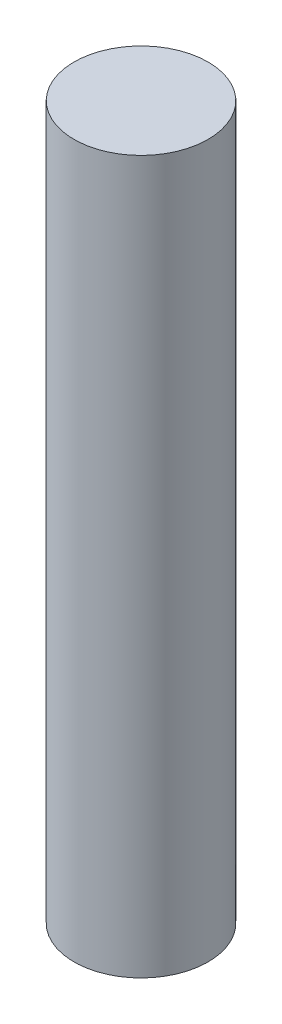
ISO-10303-21;
HEADER;
FILE_DESCRIPTION(('STEP AP214'),'2;1');
FILE_NAME('part.step','',(''),(''),'','','');
FILE_SCHEMA(('AUTOMOTIVE_DESIGN { 1 0 10303 214 1 1 1 1 }'));
ENDSEC;
DATA;
#1=APPLICATION_CONTEXT('core data for automotive mechanical design processes');
#2=APPLICATION_PROTOCOL_DEFINITION('international standard','automotive_design',2000,#1);
#3=PRODUCT_CONTEXT('',#1,'mechanical');
#4=PRODUCT('Part','Part','',(#3));
#5=PRODUCT_RELATED_PRODUCT_CATEGORY('part','',(#4));
#6=PRODUCT_DEFINITION_FORMATION('','',#4);
#7=PRODUCT_DEFINITION_CONTEXT('part definition',#1,'design');
#8=PRODUCT_DEFINITION('design','',#6,#7);
#9=PRODUCT_DEFINITION_SHAPE('','',#8);
#10=(LENGTH_UNIT() NAMED_UNIT(*) SI_UNIT(.MILLI.,.METRE.));
#11=(NAMED_UNIT(*) PLANE_ANGLE_UNIT() SI_UNIT($,.RADIAN.));
#12=(NAMED_UNIT(*) SI_UNIT($,.STERADIAN.) SOLID_ANGLE_UNIT());
#13=UNCERTAINTY_MEASURE_WITH_UNIT(LENGTH_MEASURE(1.E-05),#10,'distance_accuracy_value','');
#14=(GEOMETRIC_REPRESENTATION_CONTEXT(3) GLOBAL_UNCERTAINTY_ASSIGNED_CONTEXT((#13)) GLOBAL_UNIT_ASSIGNED_CONTEXT((#10,
#11,#12)) REPRESENTATION_CONTEXT('',''));
#15=CARTESIAN_POINT('',(0.,0.,0.));
#16=DIRECTION('',(0.,0.,1.));
#17=DIRECTION('',(1.,0.,0.));
#18=AXIS2_PLACEMENT_3D('',#15,#16,#17);
#19=CARTESIAN_POINT('',(0.,1190.,0.));
#20=DIRECTION('',(0.,1.,0.));
#21=DIRECTION('',(0.,0.,1.));
#22=AXIS2_PLACEMENT_3D('',#19,#20,#21);
#23=PLANE('',#22);
#24=CARTESIAN_POINT('',(0.,1190.,0.));
#25=DIRECTION('',(0.,-1.,0.));
#26=DIRECTION('',(0.,0.,-1.));
#27=AXIS2_PLACEMENT_3D('',#24,#25,#26);
#28=CIRCLE('',#27,112.);
#29=CARTESIAN_POINT('',(0.,1190.,-112.));
#30=VERTEX_POINT('',#29);
#31=EDGE_CURVE('E10',#30,#30,#28,.T.);
#32=ORIENTED_EDGE('',*,*,#31,.F.);
#33=EDGE_LOOP('',(#32));
#34=FACE_BOUND('',#33,.T.);
#35=ADVANCED_FACE('F40',(#34),#23,.T.);
#36=CARTESIAN_POINT('',(0.,-226.144602760346,0.));
#37=DIRECTION('',(0.,-1.,0.));
#38=DIRECTION('',(0.,0.,-1.));
#39=AXIS2_PLACEMENT_3D('',#36,#37,#38);
#40=CYLINDRICAL_SURFACE('',#39,112.);
#41=ORIENTED_EDGE('',*,*,#31,.T.);
#42=EDGE_LOOP('',(#41));
#43=FACE_BOUND('',#42,.T.);
#44=CARTESIAN_POINT('',(0.,0.,0.));
#45=DIRECTION('',(0.,-1.,0.));
#46=DIRECTION('',(0.,0.,-1.));
#47=AXIS2_PLACEMENT_3D('',#44,#45,#46);
#48=CIRCLE('',#47,112.);
#49=CARTESIAN_POINT('',(0.,0.,-112.));
#50=VERTEX_POINT('',#49);
#51=EDGE_CURVE('E43',#50,#50,#48,.T.);
#52=ORIENTED_EDGE('',*,*,#51,.F.);
#53=EDGE_LOOP('',(#52));
#54=FACE_BOUND('',#53,.T.);
#55=ADVANCED_FACE('F51',(#43,#54),#40,.T.);
#56=CARTESIAN_POINT('',(0.,0.,0.));
#57=DIRECTION('',(0.,-1.,0.));
#58=DIRECTION('',(0.,0.,-1.));
#59=AXIS2_PLACEMENT_3D('',#56,#57,#58);
#60=PLANE('',#59);
#61=ORIENTED_EDGE('',*,*,#51,.T.);
#62=EDGE_LOOP('',(#61));
#63=FACE_BOUND('',#62,.T.);
#64=ADVANCED_FACE('F47',(#63),#60,.T.);
#65=CLOSED_SHELL('',(#35,#55,#64));
#66=MANIFOLD_SOLID_BREP('B2',#65);
#67=ADVANCED_BREP_SHAPE_REPRESENTATION('',(#18,#66),#14);
#68=SHAPE_DEFINITION_REPRESENTATION(#9,#67);
ENDSEC;
END-ISO-10303-21;
